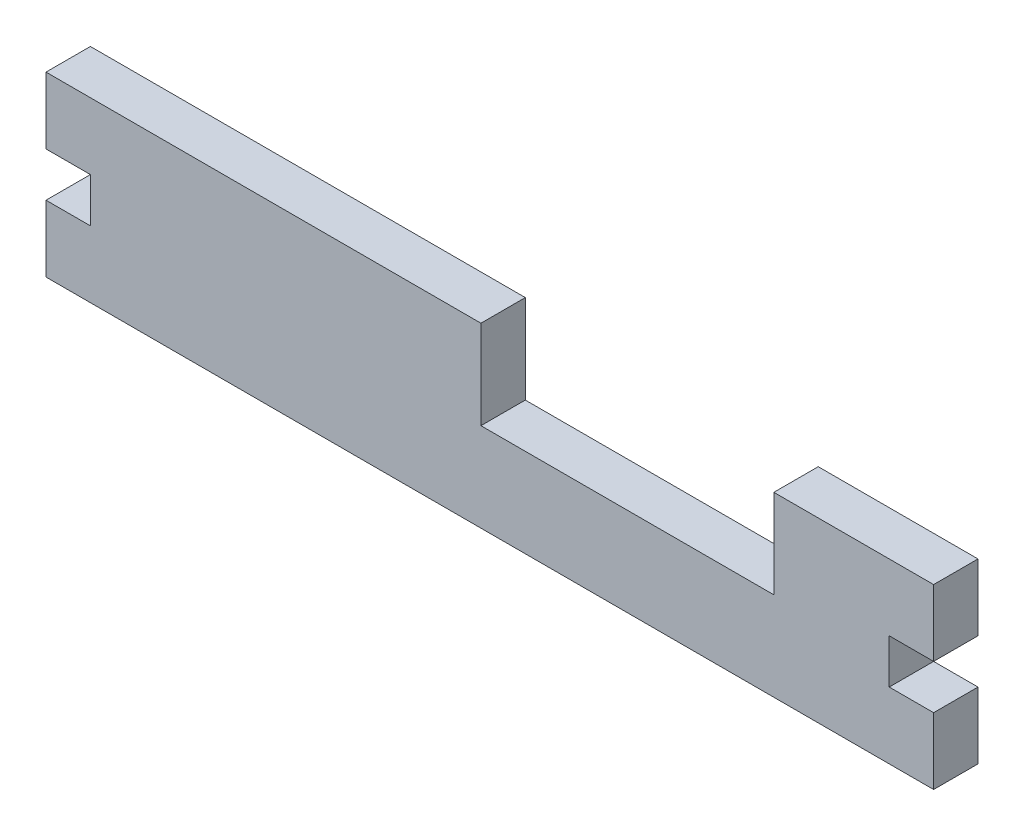
ISO-10303-21;
HEADER;
FILE_DESCRIPTION(('STEP AP214'),'2;1');
FILE_NAME('part.step','',(''),(''),'','','');
FILE_SCHEMA(('AUTOMOTIVE_DESIGN { 1 0 10303 214 1 1 1 1 }'));
ENDSEC;
DATA;
#1=APPLICATION_CONTEXT('core data for automotive mechanical design processes');
#2=APPLICATION_PROTOCOL_DEFINITION('international standard','automotive_design',2000,#1);
#3=PRODUCT_CONTEXT('',#1,'mechanical');
#4=PRODUCT('Part','Part','',(#3));
#5=PRODUCT_RELATED_PRODUCT_CATEGORY('part','',(#4));
#6=PRODUCT_DEFINITION_FORMATION('','',#4);
#7=PRODUCT_DEFINITION_CONTEXT('part definition',#1,'design');
#8=PRODUCT_DEFINITION('design','',#6,#7);
#9=PRODUCT_DEFINITION_SHAPE('','',#8);
#10=(LENGTH_UNIT() NAMED_UNIT(*) SI_UNIT(.MILLI.,.METRE.));
#11=(NAMED_UNIT(*) PLANE_ANGLE_UNIT() SI_UNIT($,.RADIAN.));
#12=(NAMED_UNIT(*) SI_UNIT($,.STERADIAN.) SOLID_ANGLE_UNIT());
#13=UNCERTAINTY_MEASURE_WITH_UNIT(LENGTH_MEASURE(1.E-05),#10,'distance_accuracy_value','');
#14=(GEOMETRIC_REPRESENTATION_CONTEXT(3) GLOBAL_UNCERTAINTY_ASSIGNED_CONTEXT((#13)) GLOBAL_UNIT_ASSIGNED_CONTEXT((#10,
#11,#12)) REPRESENTATION_CONTEXT('',''));
#15=CARTESIAN_POINT('',(0.,0.,0.));
#16=DIRECTION('',(0.,0.,1.));
#17=DIRECTION('',(1.,0.,0.));
#18=AXIS2_PLACEMENT_3D('',#15,#16,#17);
#19=CARTESIAN_POINT('',(90.,0.,5.));
#20=DIRECTION('',(0.,1.,0.));
#21=DIRECTION('',(-1.,0.,0.));
#22=AXIS2_PLACEMENT_3D('',#19,#20,#21);
#23=PLANE('',#22);
#24=DIRECTION('',(1.,0.,0.));
#25=VECTOR('',#24,1.);
#26=CARTESIAN_POINT('',(90.,0.,0.));
#27=LINE('',#26,#25);
#28=CARTESIAN_POINT('',(-5.,0.,0.));
#29=VERTEX_POINT('',#28);
#30=CARTESIAN_POINT('',(95.,0.,0.));
#31=VERTEX_POINT('',#30);
#32=EDGE_CURVE('E109',#29,#31,#27,.T.);
#33=ORIENTED_EDGE('',*,*,#32,.T.);
#34=DIRECTION('',(0.,0.,-1.));
#35=VECTOR('',#34,1.);
#36=CARTESIAN_POINT('',(95.,0.,5.));
#37=LINE('',#36,#35);
#38=CARTESIAN_POINT('',(95.,0.,5.));
#39=VERTEX_POINT('',#38);
#40=EDGE_CURVE('E11',#39,#31,#37,.T.);
#41=ORIENTED_EDGE('',*,*,#40,.F.);
#42=DIRECTION('',(1.,0.,0.));
#43=VECTOR('',#42,1.);
#44=CARTESIAN_POINT('',(0.,0.,5.));
#45=LINE('',#44,#43);
#46=CARTESIAN_POINT('',(-5.,0.,5.));
#47=VERTEX_POINT('',#46);
#48=EDGE_CURVE('E115',#47,#39,#45,.T.);
#49=ORIENTED_EDGE('',*,*,#48,.F.);
#50=DIRECTION('',(0.,0.,-1.));
#51=VECTOR('',#50,1.);
#52=CARTESIAN_POINT('',(-5.,0.,5.));
#53=LINE('',#52,#51);
#54=EDGE_CURVE('E173',#47,#29,#53,.T.);
#55=ORIENTED_EDGE('',*,*,#54,.T.);
#56=EDGE_LOOP('',(#33,#41,#49,#55));
#57=FACE_BOUND('',#56,.T.);
#58=ADVANCED_FACE('F33',(#57),#23,.F.);
#59=CARTESIAN_POINT('',(95.,0.,5.));
#60=DIRECTION('',(-1.,0.,0.));
#61=DIRECTION('',(0.,0.,1.));
#62=AXIS2_PLACEMENT_3D('',#59,#60,#61);
#63=PLANE('',#62);
#64=DIRECTION('',(0.,1.,0.));
#65=VECTOR('',#64,1.);
#66=CARTESIAN_POINT('',(95.,0.,0.));
#67=LINE('',#66,#65);
#68=CARTESIAN_POINT('',(95.,7.5,0.));
#69=VERTEX_POINT('',#68);
#70=EDGE_CURVE('E178',#31,#69,#67,.T.);
#71=ORIENTED_EDGE('',*,*,#70,.T.);
#72=DIRECTION('',(0.,0.,-1.));
#73=VECTOR('',#72,1.);
#74=CARTESIAN_POINT('',(95.,7.5,5.));
#75=LINE('',#74,#73);
#76=CARTESIAN_POINT('',(95.,7.5,5.));
#77=VERTEX_POINT('',#76);
#78=EDGE_CURVE('E41',#77,#69,#75,.T.);
#79=ORIENTED_EDGE('',*,*,#78,.F.);
#80=DIRECTION('',(0.,1.,0.));
#81=VECTOR('',#80,1.);
#82=CARTESIAN_POINT('',(95.,0.,5.));
#83=LINE('',#82,#81);
#84=EDGE_CURVE('E296',#39,#77,#83,.T.);
#85=ORIENTED_EDGE('',*,*,#84,.F.);
#86=ORIENTED_EDGE('',*,*,#40,.T.);
#87=EDGE_LOOP('',(#71,#79,#85,#86));
#88=FACE_BOUND('',#87,.T.);
#89=ADVANCED_FACE('F299',(#88),#63,.F.);
#90=CARTESIAN_POINT('',(90.,7.5,5.));
#91=DIRECTION('',(0.,-1.,0.));
#92=DIRECTION('',(1.,0.,0.));
#93=AXIS2_PLACEMENT_3D('',#90,#91,#92);
#94=PLANE('',#93);
#95=DIRECTION('',(-1.,0.,0.));
#96=VECTOR('',#95,1.);
#97=CARTESIAN_POINT('',(90.,7.5,0.));
#98=LINE('',#97,#96);
#99=CARTESIAN_POINT('',(90.,7.5,0.));
#100=VERTEX_POINT('',#99);
#101=EDGE_CURVE('E180',#69,#100,#98,.T.);
#102=ORIENTED_EDGE('',*,*,#101,.T.);
#103=DIRECTION('',(0.,0.,-1.));
#104=VECTOR('',#103,1.);
#105=CARTESIAN_POINT('',(90.,7.5,5.));
#106=LINE('',#105,#104);
#107=CARTESIAN_POINT('',(90.,7.5,5.));
#108=VERTEX_POINT('',#107);
#109=EDGE_CURVE('E239',#108,#100,#106,.T.);
#110=ORIENTED_EDGE('',*,*,#109,.F.);
#111=DIRECTION('',(-1.,0.,0.));
#112=VECTOR('',#111,1.);
#113=CARTESIAN_POINT('',(90.,7.5,5.));
#114=LINE('',#113,#112);
#115=EDGE_CURVE('E248',#77,#108,#114,.T.);
#116=ORIENTED_EDGE('',*,*,#115,.F.);
#117=ORIENTED_EDGE('',*,*,#78,.T.);
#118=EDGE_LOOP('',(#102,#110,#116,#117));
#119=FACE_BOUND('',#118,.T.);
#120=ADVANCED_FACE('F246',(#119),#94,.F.);
#121=CARTESIAN_POINT('',(90.,7.5,5.));
#122=DIRECTION('',(-1.,0.,0.));
#123=DIRECTION('',(0.,0.,1.));
#124=AXIS2_PLACEMENT_3D('',#121,#122,#123);
#125=PLANE('',#124);
#126=DIRECTION('',(0.,1.,0.));
#127=VECTOR('',#126,1.);
#128=CARTESIAN_POINT('',(90.,7.5,0.));
#129=LINE('',#128,#127);
#130=CARTESIAN_POINT('',(90.,12.5,0.));
#131=VERTEX_POINT('',#130);
#132=EDGE_CURVE('E182',#100,#131,#129,.T.);
#133=ORIENTED_EDGE('',*,*,#132,.T.);
#134=DIRECTION('',(0.,0.,-1.));
#135=VECTOR('',#134,1.);
#136=CARTESIAN_POINT('',(90.,12.5,5.));
#137=LINE('',#136,#135);
#138=CARTESIAN_POINT('',(90.,12.5,5.));
#139=VERTEX_POINT('',#138);
#140=EDGE_CURVE('E236',#139,#131,#137,.T.);
#141=ORIENTED_EDGE('',*,*,#140,.F.);
#142=DIRECTION('',(0.,1.,0.));
#143=VECTOR('',#142,1.);
#144=CARTESIAN_POINT('',(90.,7.5,5.));
#145=LINE('',#144,#143);
#146=EDGE_CURVE('E266',#108,#139,#145,.T.);
#147=ORIENTED_EDGE('',*,*,#146,.F.);
#148=ORIENTED_EDGE('',*,*,#109,.T.);
#149=EDGE_LOOP('',(#133,#141,#147,#148));
#150=FACE_BOUND('',#149,.T.);
#151=ADVANCED_FACE('F257',(#150),#125,.F.);
#152=CARTESIAN_POINT('',(90.,12.5,5.));
#153=DIRECTION('',(0.,1.,0.));
#154=DIRECTION('',(0.,0.,1.));
#155=AXIS2_PLACEMENT_3D('',#152,#153,#154);
#156=PLANE('',#155);
#157=DIRECTION('',(1.,0.,0.));
#158=VECTOR('',#157,1.);
#159=CARTESIAN_POINT('',(90.,12.5,0.));
#160=LINE('',#159,#158);
#161=CARTESIAN_POINT('',(95.,12.5,0.));
#162=VERTEX_POINT('',#161);
#163=EDGE_CURVE('E184',#131,#162,#160,.T.);
#164=ORIENTED_EDGE('',*,*,#163,.T.);
#165=DIRECTION('',(0.,0.,-1.));
#166=VECTOR('',#165,1.);
#167=CARTESIAN_POINT('',(95.,12.5,5.));
#168=LINE('',#167,#166);
#169=CARTESIAN_POINT('',(95.,12.5,5.));
#170=VERTEX_POINT('',#169);
#171=EDGE_CURVE('E233',#170,#162,#168,.T.);
#172=ORIENTED_EDGE('',*,*,#171,.F.);
#173=DIRECTION('',(1.,0.,0.));
#174=VECTOR('',#173,1.);
#175=CARTESIAN_POINT('',(90.,12.5,5.));
#176=LINE('',#175,#174);
#177=EDGE_CURVE('E263',#139,#170,#176,.T.);
#178=ORIENTED_EDGE('',*,*,#177,.F.);
#179=ORIENTED_EDGE('',*,*,#140,.T.);
#180=EDGE_LOOP('',(#164,#172,#178,#179));
#181=FACE_BOUND('',#180,.T.);
#182=ADVANCED_FACE('F261',(#181),#156,.F.);
#183=CARTESIAN_POINT('',(95.,20.,5.));
#184=DIRECTION('',(-1.,0.,0.));
#185=DIRECTION('',(0.,0.,1.));
#186=AXIS2_PLACEMENT_3D('',#183,#184,#185);
#187=PLANE('',#186);
#188=DIRECTION('',(0.,1.,0.));
#189=VECTOR('',#188,1.);
#190=CARTESIAN_POINT('',(95.,20.,0.));
#191=LINE('',#190,#189);
#192=CARTESIAN_POINT('',(95.,20.,0.));
#193=VERTEX_POINT('',#192);
#194=EDGE_CURVE('E186',#162,#193,#191,.T.);
#195=ORIENTED_EDGE('',*,*,#194,.T.);
#196=DIRECTION('',(0.,0.,-1.));
#197=VECTOR('',#196,1.);
#198=CARTESIAN_POINT('',(95.,20.,5.));
#199=LINE('',#198,#197);
#200=CARTESIAN_POINT('',(95.,20.,5.));
#201=VERTEX_POINT('',#200);
#202=EDGE_CURVE('E230',#201,#193,#199,.T.);
#203=ORIENTED_EDGE('',*,*,#202,.F.);
#204=DIRECTION('',(0.,1.,0.));
#205=VECTOR('',#204,1.);
#206=CARTESIAN_POINT('',(95.,20.,5.));
#207=LINE('',#206,#205);
#208=EDGE_CURVE('E265',#170,#201,#207,.T.);
#209=ORIENTED_EDGE('',*,*,#208,.F.);
#210=ORIENTED_EDGE('',*,*,#171,.T.);
#211=EDGE_LOOP('',(#195,#203,#209,#210));
#212=FACE_BOUND('',#211,.T.);
#213=ADVANCED_FACE('F311',(#212),#187,.F.);
#214=CARTESIAN_POINT('',(77.,20.,5.));
#215=DIRECTION('',(0.,-1.,0.));
#216=DIRECTION('',(1.,0.,0.));
#217=AXIS2_PLACEMENT_3D('',#214,#215,#216);
#218=PLANE('',#217);
#219=DIRECTION('',(-1.,0.,0.));
#220=VECTOR('',#219,1.);
#221=CARTESIAN_POINT('',(77.,20.,0.));
#222=LINE('',#221,#220);
#223=CARTESIAN_POINT('',(77.,20.,0.));
#224=VERTEX_POINT('',#223);
#225=EDGE_CURVE('E189',#193,#224,#222,.T.);
#226=ORIENTED_EDGE('',*,*,#225,.T.);
#227=DIRECTION('',(0.,0.,-1.));
#228=VECTOR('',#227,1.);
#229=CARTESIAN_POINT('',(77.,20.,5.));
#230=LINE('',#229,#228);
#231=CARTESIAN_POINT('',(77.,20.,5.));
#232=VERTEX_POINT('',#231);
#233=EDGE_CURVE('E227',#232,#224,#230,.T.);
#234=ORIENTED_EDGE('',*,*,#233,.F.);
#235=DIRECTION('',(-1.,0.,0.));
#236=VECTOR('',#235,1.);
#237=CARTESIAN_POINT('',(90.,20.,5.));
#238=LINE('',#237,#236);
#239=EDGE_CURVE('E268',#201,#232,#238,.T.);
#240=ORIENTED_EDGE('',*,*,#239,.F.);
#241=ORIENTED_EDGE('',*,*,#202,.T.);
#242=EDGE_LOOP('',(#226,#234,#240,#241));
#243=FACE_BOUND('',#242,.T.);
#244=ADVANCED_FACE('F314',(#243),#218,.F.);
#245=CARTESIAN_POINT('',(77.,20.,5.));
#246=DIRECTION('',(1.,0.,0.));
#247=DIRECTION('',(0.,0.,-1.));
#248=AXIS2_PLACEMENT_3D('',#245,#246,#247);
#249=PLANE('',#248);
#250=DIRECTION('',(0.,-1.,0.));
#251=VECTOR('',#250,1.);
#252=CARTESIAN_POINT('',(77.,20.,0.));
#253=LINE('',#252,#251);
#254=CARTESIAN_POINT('',(77.,10.,0.));
#255=VERTEX_POINT('',#254);
#256=EDGE_CURVE('E191',#224,#255,#253,.T.);
#257=ORIENTED_EDGE('',*,*,#256,.T.);
#258=DIRECTION('',(0.,0.,-1.));
#259=VECTOR('',#258,1.);
#260=CARTESIAN_POINT('',(77.,10.,5.));
#261=LINE('',#260,#259);
#262=CARTESIAN_POINT('',(77.,10.,5.));
#263=VERTEX_POINT('',#262);
#264=EDGE_CURVE('E224',#263,#255,#261,.T.);
#265=ORIENTED_EDGE('',*,*,#264,.F.);
#266=DIRECTION('',(0.,-1.,0.));
#267=VECTOR('',#266,1.);
#268=CARTESIAN_POINT('',(77.,20.,5.));
#269=LINE('',#268,#267);
#270=EDGE_CURVE('E274',#232,#263,#269,.T.);
#271=ORIENTED_EDGE('',*,*,#270,.F.);
#272=ORIENTED_EDGE('',*,*,#233,.T.);
#273=EDGE_LOOP('',(#257,#265,#271,#272));
#274=FACE_BOUND('',#273,.T.);
#275=ADVANCED_FACE('F318',(#274),#249,.F.);
#276=CARTESIAN_POINT('',(77.,10.,5.));
#277=DIRECTION('',(0.,-1.,0.));
#278=DIRECTION('',(1.,0.,0.));
#279=AXIS2_PLACEMENT_3D('',#276,#277,#278);
#280=PLANE('',#279);
#281=DIRECTION('',(-1.,0.,0.));
#282=VECTOR('',#281,1.);
#283=CARTESIAN_POINT('',(77.,10.,0.));
#284=LINE('',#283,#282);
#285=CARTESIAN_POINT('',(44.,10.,0.));
#286=VERTEX_POINT('',#285);
#287=EDGE_CURVE('E193',#255,#286,#284,.T.);
#288=ORIENTED_EDGE('',*,*,#287,.T.);
#289=DIRECTION('',(0.,0.,-1.));
#290=VECTOR('',#289,1.);
#291=CARTESIAN_POINT('',(44.,10.,5.));
#292=LINE('',#291,#290);
#293=CARTESIAN_POINT('',(44.,10.,5.));
#294=VERTEX_POINT('',#293);
#295=EDGE_CURVE('E221',#294,#286,#292,.T.);
#296=ORIENTED_EDGE('',*,*,#295,.F.);
#297=DIRECTION('',(-1.,0.,0.));
#298=VECTOR('',#297,1.);
#299=CARTESIAN_POINT('',(77.,10.,5.));
#300=LINE('',#299,#298);
#301=EDGE_CURVE('E276',#263,#294,#300,.T.);
#302=ORIENTED_EDGE('',*,*,#301,.F.);
#303=ORIENTED_EDGE('',*,*,#264,.T.);
#304=EDGE_LOOP('',(#288,#296,#302,#303));
#305=FACE_BOUND('',#304,.T.);
#306=ADVANCED_FACE('F322',(#305),#280,.F.);
#307=CARTESIAN_POINT('',(44.,20.,5.));
#308=DIRECTION('',(-1.,0.,0.));
#309=DIRECTION('',(0.,0.,1.));
#310=AXIS2_PLACEMENT_3D('',#307,#308,#309);
#311=PLANE('',#310);
#312=DIRECTION('',(0.,1.,0.));
#313=VECTOR('',#312,1.);
#314=CARTESIAN_POINT('',(44.,20.,0.));
#315=LINE('',#314,#313);
#316=CARTESIAN_POINT('',(44.,20.,0.));
#317=VERTEX_POINT('',#316);
#318=EDGE_CURVE('E195',#286,#317,#315,.T.);
#319=ORIENTED_EDGE('',*,*,#318,.T.);
#320=DIRECTION('',(0.,0.,-1.));
#321=VECTOR('',#320,1.);
#322=CARTESIAN_POINT('',(44.,20.,5.));
#323=LINE('',#322,#321);
#324=CARTESIAN_POINT('',(44.,20.,5.));
#325=VERTEX_POINT('',#324);
#326=EDGE_CURVE('E218',#325,#317,#323,.T.);
#327=ORIENTED_EDGE('',*,*,#326,.F.);
#328=DIRECTION('',(0.,1.,0.));
#329=VECTOR('',#328,1.);
#330=CARTESIAN_POINT('',(44.,20.,5.));
#331=LINE('',#330,#329);
#332=EDGE_CURVE('E278',#294,#325,#331,.T.);
#333=ORIENTED_EDGE('',*,*,#332,.F.);
#334=ORIENTED_EDGE('',*,*,#295,.T.);
#335=EDGE_LOOP('',(#319,#327,#333,#334));
#336=FACE_BOUND('',#335,.T.);
#337=ADVANCED_FACE('F326',(#336),#311,.F.);
#338=CARTESIAN_POINT('',(0.,20.,5.));
#339=DIRECTION('',(0.,-1.,0.));
#340=DIRECTION('',(0.,0.,-1.));
#341=AXIS2_PLACEMENT_3D('',#338,#339,#340);
#342=PLANE('',#341);
#343=DIRECTION('',(-1.,0.,0.));
#344=VECTOR('',#343,1.);
#345=CARTESIAN_POINT('',(0.,20.,0.));
#346=LINE('',#345,#344);
#347=CARTESIAN_POINT('',(-5.,20.,0.));
#348=VERTEX_POINT('',#347);
#349=EDGE_CURVE('E198',#317,#348,#346,.T.);
#350=ORIENTED_EDGE('',*,*,#349,.T.);
#351=DIRECTION('',(0.,0.,-1.));
#352=VECTOR('',#351,1.);
#353=CARTESIAN_POINT('',(-5.,20.,5.));
#354=LINE('',#353,#352);
#355=CARTESIAN_POINT('',(-5.,20.,5.));
#356=VERTEX_POINT('',#355);
#357=EDGE_CURVE('E215',#356,#348,#354,.T.);
#358=ORIENTED_EDGE('',*,*,#357,.F.);
#359=DIRECTION('',(-1.,0.,0.));
#360=VECTOR('',#359,1.);
#361=CARTESIAN_POINT('',(0.,20.,5.));
#362=LINE('',#361,#360);
#363=EDGE_CURVE('E280',#325,#356,#362,.T.);
#364=ORIENTED_EDGE('',*,*,#363,.F.);
#365=ORIENTED_EDGE('',*,*,#326,.T.);
#366=EDGE_LOOP('',(#350,#358,#364,#365));
#367=FACE_BOUND('',#366,.T.);
#368=ADVANCED_FACE('F330',(#367),#342,.F.);
#369=CARTESIAN_POINT('',(-5.,20.,5.));
#370=DIRECTION('',(1.,0.,0.));
#371=DIRECTION('',(0.,0.,-1.));
#372=AXIS2_PLACEMENT_3D('',#369,#370,#371);
#373=PLANE('',#372);
#374=DIRECTION('',(0.,-1.,0.));
#375=VECTOR('',#374,1.);
#376=CARTESIAN_POINT('',(-5.,20.,0.));
#377=LINE('',#376,#375);
#378=CARTESIAN_POINT('',(-5.,12.5,0.));
#379=VERTEX_POINT('',#378);
#380=EDGE_CURVE('E200',#348,#379,#377,.T.);
#381=ORIENTED_EDGE('',*,*,#380,.T.);
#382=DIRECTION('',(0.,0.,-1.));
#383=VECTOR('',#382,1.);
#384=CARTESIAN_POINT('',(-5.,12.5,5.));
#385=LINE('',#384,#383);
#386=CARTESIAN_POINT('',(-5.,12.5,5.));
#387=VERTEX_POINT('',#386);
#388=EDGE_CURVE('E212',#387,#379,#385,.T.);
#389=ORIENTED_EDGE('',*,*,#388,.F.);
#390=DIRECTION('',(0.,-1.,0.));
#391=VECTOR('',#390,1.);
#392=CARTESIAN_POINT('',(-5.,20.,5.));
#393=LINE('',#392,#391);
#394=EDGE_CURVE('E282',#356,#387,#393,.T.);
#395=ORIENTED_EDGE('',*,*,#394,.F.);
#396=ORIENTED_EDGE('',*,*,#357,.T.);
#397=EDGE_LOOP('',(#381,#389,#395,#396));
#398=FACE_BOUND('',#397,.T.);
#399=ADVANCED_FACE('F288',(#398),#373,.F.);
#400=CARTESIAN_POINT('',(0.,12.5,5.));
#401=DIRECTION('',(0.,1.,0.));
#402=DIRECTION('',(0.,0.,1.));
#403=AXIS2_PLACEMENT_3D('',#400,#401,#402);
#404=PLANE('',#403);
#405=DIRECTION('',(1.,0.,0.));
#406=VECTOR('',#405,1.);
#407=CARTESIAN_POINT('',(0.,12.5,0.));
#408=LINE('',#407,#406);
#409=CARTESIAN_POINT('',(0.,12.5,0.));
#410=VERTEX_POINT('',#409);
#411=EDGE_CURVE('E202',#379,#410,#408,.T.);
#412=ORIENTED_EDGE('',*,*,#411,.T.);
#413=DIRECTION('',(0.,0.,-1.));
#414=VECTOR('',#413,1.);
#415=CARTESIAN_POINT('',(0.,12.5,5.));
#416=LINE('',#415,#414);
#417=CARTESIAN_POINT('',(0.,12.5,5.));
#418=VERTEX_POINT('',#417);
#419=EDGE_CURVE('E168',#418,#410,#416,.T.);
#420=ORIENTED_EDGE('',*,*,#419,.F.);
#421=DIRECTION('',(1.,0.,0.));
#422=VECTOR('',#421,1.);
#423=CARTESIAN_POINT('',(0.,12.5,5.));
#424=LINE('',#423,#422);
#425=EDGE_CURVE('E159',#387,#418,#424,.T.);
#426=ORIENTED_EDGE('',*,*,#425,.F.);
#427=ORIENTED_EDGE('',*,*,#388,.T.);
#428=EDGE_LOOP('',(#412,#420,#426,#427));
#429=FACE_BOUND('',#428,.T.);
#430=ADVANCED_FACE('F292',(#429),#404,.F.);
#431=CARTESIAN_POINT('',(0.,7.5,5.));
#432=DIRECTION('',(1.,0.,0.));
#433=DIRECTION('',(0.,0.,-1.));
#434=AXIS2_PLACEMENT_3D('',#431,#432,#433);
#435=PLANE('',#434);
#436=DIRECTION('',(0.,-1.,0.));
#437=VECTOR('',#436,1.);
#438=CARTESIAN_POINT('',(0.,7.5,0.));
#439=LINE('',#438,#437);
#440=CARTESIAN_POINT('',(0.,7.5,0.));
#441=VERTEX_POINT('',#440);
#442=EDGE_CURVE('E167',#410,#441,#439,.T.);
#443=ORIENTED_EDGE('',*,*,#442,.T.);
#444=DIRECTION('',(0.,0.,-1.));
#445=VECTOR('',#444,1.);
#446=CARTESIAN_POINT('',(0.,7.5,5.));
#447=LINE('',#446,#445);
#448=CARTESIAN_POINT('',(0.,7.5,5.));
#449=VERTEX_POINT('',#448);
#450=EDGE_CURVE('E164',#449,#441,#447,.T.);
#451=ORIENTED_EDGE('',*,*,#450,.F.);
#452=DIRECTION('',(0.,-1.,0.));
#453=VECTOR('',#452,1.);
#454=CARTESIAN_POINT('',(0.,7.5,5.));
#455=LINE('',#454,#453);
#456=EDGE_CURVE('E153',#418,#449,#455,.T.);
#457=ORIENTED_EDGE('',*,*,#456,.F.);
#458=ORIENTED_EDGE('',*,*,#419,.T.);
#459=EDGE_LOOP('',(#443,#451,#457,#458));
#460=FACE_BOUND('',#459,.T.);
#461=ADVANCED_FACE('F165',(#460),#435,.F.);
#462=CARTESIAN_POINT('',(0.,7.5,5.));
#463=DIRECTION('',(0.,-1.,0.));
#464=DIRECTION('',(1.,0.,0.));
#465=AXIS2_PLACEMENT_3D('',#462,#463,#464);
#466=PLANE('',#465);
#467=DIRECTION('',(-1.,0.,0.));
#468=VECTOR('',#467,1.);
#469=CARTESIAN_POINT('',(0.,7.5,0.));
#470=LINE('',#469,#468);
#471=CARTESIAN_POINT('',(-5.,7.5,0.));
#472=VERTEX_POINT('',#471);
#473=EDGE_CURVE('E102',#441,#472,#470,.T.);
#474=ORIENTED_EDGE('',*,*,#473,.T.);
#475=DIRECTION('',(0.,0.,-1.));
#476=VECTOR('',#475,1.);
#477=CARTESIAN_POINT('',(-5.,7.5,5.));
#478=LINE('',#477,#476);
#479=CARTESIAN_POINT('',(-5.,7.5,5.));
#480=VERTEX_POINT('',#479);
#481=EDGE_CURVE('E169',#480,#472,#478,.T.);
#482=ORIENTED_EDGE('',*,*,#481,.F.);
#483=DIRECTION('',(-1.,0.,0.));
#484=VECTOR('',#483,1.);
#485=CARTESIAN_POINT('',(0.,7.5,5.));
#486=LINE('',#485,#484);
#487=EDGE_CURVE('E157',#449,#480,#486,.T.);
#488=ORIENTED_EDGE('',*,*,#487,.F.);
#489=ORIENTED_EDGE('',*,*,#450,.T.);
#490=EDGE_LOOP('',(#474,#482,#488,#489));
#491=FACE_BOUND('',#490,.T.);
#492=ADVANCED_FACE('F171',(#491),#466,.F.);
#493=CARTESIAN_POINT('',(-5.,0.,5.));
#494=DIRECTION('',(1.,0.,0.));
#495=DIRECTION('',(0.,0.,-1.));
#496=AXIS2_PLACEMENT_3D('',#493,#494,#495);
#497=PLANE('',#496);
#498=DIRECTION('',(0.,-1.,0.));
#499=VECTOR('',#498,1.);
#500=CARTESIAN_POINT('',(-5.,0.,0.));
#501=LINE('',#500,#499);
#502=EDGE_CURVE('E206',#472,#29,#501,.T.);
#503=ORIENTED_EDGE('',*,*,#502,.T.);
#504=ORIENTED_EDGE('',*,*,#54,.F.);
#505=DIRECTION('',(0.,-1.,0.));
#506=VECTOR('',#505,1.);
#507=CARTESIAN_POINT('',(-5.,0.,5.));
#508=LINE('',#507,#506);
#509=EDGE_CURVE('E49',#480,#47,#508,.T.);
#510=ORIENTED_EDGE('',*,*,#509,.F.);
#511=ORIENTED_EDGE('',*,*,#481,.T.);
#512=EDGE_LOOP('',(#503,#504,#510,#511));
#513=FACE_BOUND('',#512,.T.);
#514=ADVANCED_FACE('F294',(#513),#497,.F.);
#515=CARTESIAN_POINT('',(0.,0.,5.));
#516=DIRECTION('',(0.,0.,-1.));
#517=DIRECTION('',(-1.,0.,0.));
#518=AXIS2_PLACEMENT_3D('',#515,#516,#517);
#519=PLANE('',#518);
#520=ORIENTED_EDGE('',*,*,#48,.T.);
#521=ORIENTED_EDGE('',*,*,#84,.T.);
#522=ORIENTED_EDGE('',*,*,#115,.T.);
#523=ORIENTED_EDGE('',*,*,#146,.T.);
#524=ORIENTED_EDGE('',*,*,#177,.T.);
#525=ORIENTED_EDGE('',*,*,#208,.T.);
#526=ORIENTED_EDGE('',*,*,#239,.T.);
#527=ORIENTED_EDGE('',*,*,#270,.T.);
#528=ORIENTED_EDGE('',*,*,#301,.T.);
#529=ORIENTED_EDGE('',*,*,#332,.T.);
#530=ORIENTED_EDGE('',*,*,#363,.T.);
#531=ORIENTED_EDGE('',*,*,#394,.T.);
#532=ORIENTED_EDGE('',*,*,#425,.T.);
#533=ORIENTED_EDGE('',*,*,#456,.T.);
#534=ORIENTED_EDGE('',*,*,#487,.T.);
#535=ORIENTED_EDGE('',*,*,#509,.T.);
#536=EDGE_LOOP('',(#520,#521,#522,#523,#524,#525,#526,#527,#528,#529,#530,#531,#532,#533,#534,#535));
#537=FACE_BOUND('',#536,.T.);
#538=ADVANCED_FACE('F155',(#537),#519,.F.);
#539=CARTESIAN_POINT('',(0.,0.,0.));
#540=DIRECTION('',(0.,0.,-1.));
#541=DIRECTION('',(-1.,0.,0.));
#542=AXIS2_PLACEMENT_3D('',#539,#540,#541);
#543=PLANE('',#542);
#544=ORIENTED_EDGE('',*,*,#32,.F.);
#545=ORIENTED_EDGE('',*,*,#502,.F.);
#546=ORIENTED_EDGE('',*,*,#473,.F.);
#547=ORIENTED_EDGE('',*,*,#442,.F.);
#548=ORIENTED_EDGE('',*,*,#411,.F.);
#549=ORIENTED_EDGE('',*,*,#380,.F.);
#550=ORIENTED_EDGE('',*,*,#349,.F.);
#551=ORIENTED_EDGE('',*,*,#318,.F.);
#552=ORIENTED_EDGE('',*,*,#287,.F.);
#553=ORIENTED_EDGE('',*,*,#256,.F.);
#554=ORIENTED_EDGE('',*,*,#225,.F.);
#555=ORIENTED_EDGE('',*,*,#194,.F.);
#556=ORIENTED_EDGE('',*,*,#163,.F.);
#557=ORIENTED_EDGE('',*,*,#132,.F.);
#558=ORIENTED_EDGE('',*,*,#101,.F.);
#559=ORIENTED_EDGE('',*,*,#70,.F.);
#560=EDGE_LOOP('',(#544,#545,#546,#547,#548,#549,#550,#551,#552,#553,#554,#555,#556,#557,#558,#559));
#561=FACE_BOUND('',#560,.T.);
#562=ADVANCED_FACE('F252',(#561),#543,.T.);
#563=CLOSED_SHELL('',(#58,#89,#120,#151,#182,#213,#244,#275,#306,#337,#368,#399,#430,#461,#492,
#514,#538,#562));
#564=MANIFOLD_SOLID_BREP('B2',#563);
#565=ADVANCED_BREP_SHAPE_REPRESENTATION('',(#18,#564),#14);
#566=SHAPE_DEFINITION_REPRESENTATION(#9,#565);
ENDSEC;
END-ISO-10303-21;
